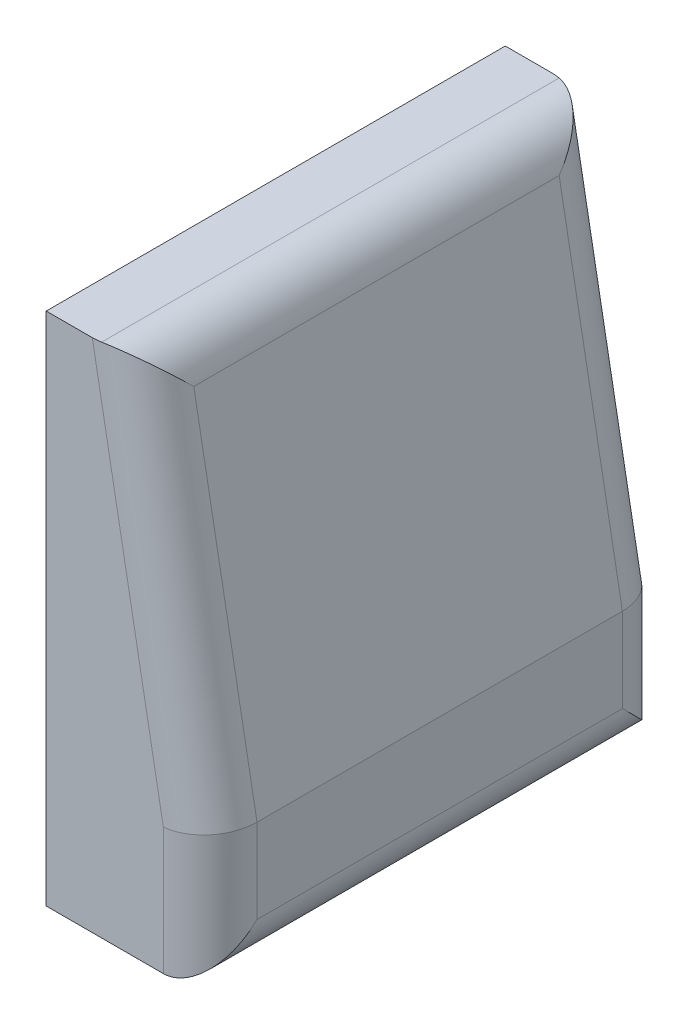
ISO-10303-21;
HEADER;
FILE_DESCRIPTION(('STEP AP214'),'2;1');
FILE_NAME('part.step','',(''),(''),'','','');
FILE_SCHEMA(('AUTOMOTIVE_DESIGN { 1 0 10303 214 1 1 1 1 }'));
ENDSEC;
DATA;
#1=APPLICATION_CONTEXT('core data for automotive mechanical design processes');
#2=APPLICATION_PROTOCOL_DEFINITION('international standard','automotive_design',2000,#1);
#3=PRODUCT_CONTEXT('',#1,'mechanical');
#4=PRODUCT('Part','Part','',(#3));
#5=PRODUCT_RELATED_PRODUCT_CATEGORY('part','',(#4));
#6=PRODUCT_DEFINITION_FORMATION('','',#4);
#7=PRODUCT_DEFINITION_CONTEXT('part definition',#1,'design');
#8=PRODUCT_DEFINITION('design','',#6,#7);
#9=PRODUCT_DEFINITION_SHAPE('','',#8);
#10=(LENGTH_UNIT() NAMED_UNIT(*) SI_UNIT(.MILLI.,.METRE.));
#11=(NAMED_UNIT(*) PLANE_ANGLE_UNIT() SI_UNIT($,.RADIAN.));
#12=(NAMED_UNIT(*) SI_UNIT($,.STERADIAN.) SOLID_ANGLE_UNIT());
#13=UNCERTAINTY_MEASURE_WITH_UNIT(LENGTH_MEASURE(1.E-05),#10,'distance_accuracy_value','');
#14=(GEOMETRIC_REPRESENTATION_CONTEXT(3) GLOBAL_UNCERTAINTY_ASSIGNED_CONTEXT((#13)) GLOBAL_UNIT_ASSIGNED_CONTEXT((#10,
#11,#12)) REPRESENTATION_CONTEXT('',''));
#15=CARTESIAN_POINT('',(0.,0.,0.));
#16=DIRECTION('',(0.,0.,1.));
#17=DIRECTION('',(1.,0.,0.));
#18=AXIS2_PLACEMENT_3D('',#15,#16,#17);
#19=CARTESIAN_POINT('',(200.,664.4,490.));
#20=DIRECTION('',(0.,-1.,0.));
#21=DIRECTION('',(0.,0.,-1.));
#22=AXIS2_PLACEMENT_3D('',#19,#20,#21);
#23=PLANE('',#22);
#24=DIRECTION('',(0.,0.,-1.));
#25=VECTOR('',#24,1.);
#26=CARTESIAN_POINT('',(116.633338798208,664.4,490.));
#27=LINE('',#26,#25);
#28=CARTESIAN_POINT('',(116.633338798208,664.4,488.367740670723));
#29=VERTEX_POINT('',#28);
#30=CARTESIAN_POINT('',(116.633338798208,664.4,-488.367740670723));
#31=VERTEX_POINT('',#30);
#32=EDGE_CURVE('E53',#29,#31,#27,.T.);
#33=ORIENTED_EDGE('',*,*,#32,.T.);
#34=CARTESIAN_POINT('',(98.3406558713784,664.4,-390.));
#35=DIRECTION('',(0.,-1.,0.));
#36=DIRECTION('',(-1.,0.,0.));
#37=AXIS2_PLACEMENT_3D('',#34,#35,#36);
#38=ELLIPSE('',#37,101.659344128622,100.);
#39=CARTESIAN_POINT('',(98.3406558713785,664.4,-490.));
#40=VERTEX_POINT('',#39);
#41=EDGE_CURVE('E11',#31,#40,#38,.F.);
#42=ORIENTED_EDGE('',*,*,#41,.T.);
#43=DIRECTION('',(-1.,0.,0.));
#44=VECTOR('',#43,1.);
#45=CARTESIAN_POINT('',(200.,664.4,-490.));
#46=LINE('',#45,#44);
#47=CARTESIAN_POINT('',(0.,664.4,-490.));
#48=VERTEX_POINT('',#47);
#49=EDGE_CURVE('E135',#40,#48,#46,.T.);
#50=ORIENTED_EDGE('',*,*,#49,.T.);
#51=DIRECTION('',(0.,0.,-1.));
#52=VECTOR('',#51,1.);
#53=CARTESIAN_POINT('',(0.,664.4,490.));
#54=LINE('',#53,#52);
#55=CARTESIAN_POINT('',(0.,664.4,490.));
#56=VERTEX_POINT('',#55);
#57=EDGE_CURVE('E127',#56,#48,#54,.T.);
#58=ORIENTED_EDGE('',*,*,#57,.F.);
#59=DIRECTION('',(-1.,0.,0.));
#60=VECTOR('',#59,1.);
#61=CARTESIAN_POINT('',(200.,664.4,490.));
#62=LINE('',#61,#60);
#63=CARTESIAN_POINT('',(98.3406558713785,664.4,490.));
#64=VERTEX_POINT('',#63);
#65=EDGE_CURVE('E112',#64,#56,#62,.T.);
#66=ORIENTED_EDGE('',*,*,#65,.F.);
#67=CARTESIAN_POINT('',(98.3406558713785,664.4,390.));
#68=DIRECTION('',(0.,-1.,0.));
#69=DIRECTION('',(1.,0.,0.));
#70=AXIS2_PLACEMENT_3D('',#67,#68,#69);
#71=ELLIPSE('',#70,101.659344128622,100.);
#72=EDGE_CURVE('E64',#64,#29,#71,.F.);
#73=ORIENTED_EDGE('',*,*,#72,.T.);
#74=EDGE_LOOP('',(#33,#42,#50,#58,#66,#73));
#75=FACE_BOUND('',#74,.T.);
#76=ADVANCED_FACE('F43',(#75),#23,.F.);
#77=CARTESIAN_POINT('',(0.,664.4,490.));
#78=DIRECTION('',(1.,0.,0.));
#79=DIRECTION('',(0.,0.,-1.));
#80=AXIS2_PLACEMENT_3D('',#77,#78,#79);
#81=PLANE('',#80);
#82=DIRECTION('',(0.,-1.,0.));
#83=VECTOR('',#82,1.);
#84=CARTESIAN_POINT('',(0.,664.4,-490.));
#85=LINE('',#84,#83);
#86=CARTESIAN_POINT('',(0.,-435.6,-490.));
#87=VERTEX_POINT('',#86);
#88=EDGE_CURVE('E207',#48,#87,#85,.T.);
#89=ORIENTED_EDGE('',*,*,#88,.T.);
#90=DIRECTION('',(0.,0.,-1.));
#91=VECTOR('',#90,1.);
#92=CARTESIAN_POINT('',(0.,-435.6,490.));
#93=LINE('',#92,#91);
#94=CARTESIAN_POINT('',(0.,-435.6,490.));
#95=VERTEX_POINT('',#94);
#96=EDGE_CURVE('E129',#95,#87,#93,.T.);
#97=ORIENTED_EDGE('',*,*,#96,.F.);
#98=DIRECTION('',(0.,-1.,0.));
#99=VECTOR('',#98,1.);
#100=CARTESIAN_POINT('',(0.,664.4,490.));
#101=LINE('',#100,#99);
#102=EDGE_CURVE('E116',#56,#95,#101,.T.);
#103=ORIENTED_EDGE('',*,*,#102,.F.);
#104=ORIENTED_EDGE('',*,*,#57,.T.);
#105=EDGE_LOOP('',(#89,#97,#103,#104));
#106=FACE_BOUND('',#105,.T.);
#107=ADVANCED_FACE('F126',(#106),#81,.F.);
#108=CARTESIAN_POINT('',(0.,-435.6,490.));
#109=DIRECTION('',(0.,1.,0.));
#110=DIRECTION('',(-1.,0.,0.));
#111=AXIS2_PLACEMENT_3D('',#108,#109,#110);
#112=PLANE('',#111);
#113=DIRECTION('',(1.,0.,0.));
#114=VECTOR('',#113,1.);
#115=CARTESIAN_POINT('',(0.,-435.6,-490.));
#116=LINE('',#115,#114);
#117=CARTESIAN_POINT('',(250.,-435.6,-490.));
#118=VERTEX_POINT('',#117);
#119=EDGE_CURVE('E122',#87,#118,#116,.T.);
#120=ORIENTED_EDGE('',*,*,#119,.T.);
#121=DIRECTION('',(0.,0.,-1.));
#122=VECTOR('',#121,1.);
#123=CARTESIAN_POINT('',(250.,-435.6,490.));
#124=LINE('',#123,#122);
#125=CARTESIAN_POINT('',(250.,-435.6,490.));
#126=VERTEX_POINT('',#125);
#127=EDGE_CURVE('E154',#118,#126,#124,.F.);
#128=ORIENTED_EDGE('',*,*,#127,.T.);
#129=DIRECTION('',(1.,0.,0.));
#130=VECTOR('',#129,1.);
#131=CARTESIAN_POINT('',(0.,-435.6,490.));
#132=LINE('',#131,#130);
#133=EDGE_CURVE('E132',#95,#126,#132,.T.);
#134=ORIENTED_EDGE('',*,*,#133,.F.);
#135=ORIENTED_EDGE('',*,*,#96,.T.);
#136=EDGE_LOOP('',(#120,#128,#134,#135));
#137=FACE_BOUND('',#136,.T.);
#138=ADVANCED_FACE('F222',(#137),#112,.F.);
#139=CARTESIAN_POINT('',(350.,-435.6,490.));
#140=DIRECTION('',(-1.,0.,0.));
#141=DIRECTION('',(0.,0.,1.));
#142=AXIS2_PLACEMENT_3D('',#139,#140,#141);
#143=PLANE('',#142);
#144=DIRECTION('',(0.,0.,-1.));
#145=VECTOR('',#144,1.);
#146=CARTESIAN_POINT('',(350.,-155.6,490.));
#147=LINE('',#146,#145);
#148=CARTESIAN_POINT('',(350.,-155.6,390.));
#149=VERTEX_POINT('',#148);
#150=CARTESIAN_POINT('',(350.,-155.6,-390.));
#151=VERTEX_POINT('',#150);
#152=EDGE_CURVE('E144',#149,#151,#147,.T.);
#153=ORIENTED_EDGE('',*,*,#152,.F.);
#154=DIRECTION('',(0.,1.,0.));
#155=VECTOR('',#154,1.);
#156=CARTESIAN_POINT('',(350.,-435.6,390.));
#157=LINE('',#156,#155);
#158=CARTESIAN_POINT('',(350.,-335.6,390.));
#159=VERTEX_POINT('',#158);
#160=EDGE_CURVE('E151',#149,#159,#157,.F.);
#161=ORIENTED_EDGE('',*,*,#160,.T.);
#162=DIRECTION('',(0.,0.,-1.));
#163=VECTOR('',#162,1.);
#164=CARTESIAN_POINT('',(350.,-335.6,490.));
#165=LINE('',#164,#163);
#166=CARTESIAN_POINT('',(350.,-335.6,-390.));
#167=VERTEX_POINT('',#166);
#168=EDGE_CURVE('E142',#159,#167,#165,.T.);
#169=ORIENTED_EDGE('',*,*,#168,.T.);
#170=DIRECTION('',(0.,1.,0.));
#171=VECTOR('',#170,1.);
#172=CARTESIAN_POINT('',(350.,-435.6,-390.));
#173=LINE('',#172,#171);
#174=EDGE_CURVE('E138',#167,#151,#173,.T.);
#175=ORIENTED_EDGE('',*,*,#174,.T.);
#176=EDGE_LOOP('',(#153,#161,#169,#175));
#177=FACE_BOUND('',#176,.T.);
#178=ADVANCED_FACE('F236',(#177),#143,.F.);
#179=CARTESIAN_POINT('',(350.,-155.6,490.));
#180=DIRECTION('',(-0.983677406707226,-0.17994098903181,0.));
#181=DIRECTION('',(0.17994098903181,-0.983677406707226,0.));
#182=AXIS2_PLACEMENT_3D('',#179,#180,#181);
#183=PLANE('',#182);
#184=ORIENTED_EDGE('',*,*,#152,.T.);
#185=DIRECTION('',(-0.17994098903181,0.983677406707226,0.));
#186=VECTOR('',#185,1.);
#187=CARTESIAN_POINT('',(350.,-155.6,-390.));
#188=LINE('',#187,#186);
#189=CARTESIAN_POINT('',(215.00107946893,582.394098903181,-390.));
#190=VERTEX_POINT('',#189);
#191=EDGE_CURVE('E175',#151,#190,#188,.T.);
#192=ORIENTED_EDGE('',*,*,#191,.T.);
#193=DIRECTION('',(0.,0.,-1.));
#194=VECTOR('',#193,1.);
#195=CARTESIAN_POINT('',(215.00107946893,582.394098903181,490.));
#196=LINE('',#195,#194);
#197=CARTESIAN_POINT('',(215.00107946893,582.394098903181,390.));
#198=VERTEX_POINT('',#197);
#199=EDGE_CURVE('E172',#190,#198,#196,.F.);
#200=ORIENTED_EDGE('',*,*,#199,.T.);
#201=DIRECTION('',(-0.17994098903181,0.983677406707226,0.));
#202=VECTOR('',#201,1.);
#203=CARTESIAN_POINT('',(350.,-155.6,390.));
#204=LINE('',#203,#202);
#205=EDGE_CURVE('E169',#198,#149,#204,.F.);
#206=ORIENTED_EDGE('',*,*,#205,.T.);
#207=EDGE_LOOP('',(#184,#192,#200,#206));
#208=FACE_BOUND('',#207,.T.);
#209=ADVANCED_FACE('F242',(#208),#183,.F.);
#210=CARTESIAN_POINT('',(0.,0.,490.));
#211=DIRECTION('',(0.,0.,1.));
#212=DIRECTION('',(1.,0.,0.));
#213=AXIS2_PLACEMENT_3D('',#210,#211,#212);
#214=PLANE('',#213);
#215=ORIENTED_EDGE('',*,*,#133,.T.);
#216=DIRECTION('',(0.,1.,0.));
#217=VECTOR('',#216,1.);
#218=CARTESIAN_POINT('',(250.,-155.6,490.));
#219=LINE('',#218,#217);
#220=CARTESIAN_POINT('',(250.,-164.671081236464,490.));
#221=VERTEX_POINT('',#220);
#222=EDGE_CURVE('E160',#126,#221,#219,.T.);
#223=ORIENTED_EDGE('',*,*,#222,.T.);
#224=DIRECTION('',(-0.17994098903181,0.983677406707226,0.));
#225=VECTOR('',#224,1.);
#226=CARTESIAN_POINT('',(101.632259329277,646.405901096819,490.));
#227=LINE('',#226,#225);
#228=EDGE_CURVE('E119',#221,#64,#227,.T.);
#229=ORIENTED_EDGE('',*,*,#228,.T.);
#230=ORIENTED_EDGE('',*,*,#65,.T.);
#231=ORIENTED_EDGE('',*,*,#102,.T.);
#232=EDGE_LOOP('',(#215,#223,#229,#230,#231));
#233=FACE_BOUND('',#232,.T.);
#234=ADVANCED_FACE('F115',(#233),#214,.T.);
#235=CARTESIAN_POINT('',(0.,0.,-490.));
#236=DIRECTION('',(0.,0.,1.));
#237=DIRECTION('',(1.,0.,0.));
#238=AXIS2_PLACEMENT_3D('',#235,#236,#237);
#239=PLANE('',#238);
#240=DIRECTION('',(-0.17994098903181,0.983677406707226,0.));
#241=VECTOR('',#240,1.);
#242=CARTESIAN_POINT('',(212.757888916268,38.9191260212686,-490.));
#243=LINE('',#242,#241);
#244=CARTESIAN_POINT('',(250.,-164.671081236465,-490.));
#245=VERTEX_POINT('',#244);
#246=EDGE_CURVE('E163',#40,#245,#243,.F.);
#247=ORIENTED_EDGE('',*,*,#246,.T.);
#248=DIRECTION('',(0.,1.,0.));
#249=VECTOR('',#248,1.);
#250=CARTESIAN_POINT('',(250.,0.,-490.));
#251=LINE('',#250,#249);
#252=EDGE_CURVE('E166',#245,#118,#251,.F.);
#253=ORIENTED_EDGE('',*,*,#252,.T.);
#254=ORIENTED_EDGE('',*,*,#119,.F.);
#255=ORIENTED_EDGE('',*,*,#88,.F.);
#256=ORIENTED_EDGE('',*,*,#49,.F.);
#257=EDGE_LOOP('',(#247,#253,#254,#255,#256));
#258=FACE_BOUND('',#257,.T.);
#259=ADVANCED_FACE('F248',(#258),#239,.F.);
#260=CARTESIAN_POINT('',(116.633338798208,564.4,490.));
#261=DIRECTION('',(0.,0.,-1.));
#262=DIRECTION('',(-1.,0.,0.));
#263=AXIS2_PLACEMENT_3D('',#260,#261,#262);
#264=CYLINDRICAL_SURFACE('',#263,100.);
#265=CARTESIAN_POINT('',(116.633338798208,564.4,-390.));
#266=DIRECTION('',(0.127237493557807,-0.695564964782677,-0.707106781186547));
#267=DIRECTION('',(-0.127237493557807,0.695564964782677,-0.707106781186547));
#268=AXIS2_PLACEMENT_3D('',#265,#266,#267);
#269=ELLIPSE('',#268,141.42135623731,100.);
#270=EDGE_CURVE('E195',#31,#190,#269,.T.);
#271=ORIENTED_EDGE('',*,*,#270,.F.);
#272=ORIENTED_EDGE('',*,*,#32,.F.);
#273=CARTESIAN_POINT('',(116.633338798208,564.4,390.));
#274=DIRECTION('',(0.127237493557807,-0.695564964782677,0.707106781186547));
#275=DIRECTION('',(0.127237493557807,-0.695564964782677,-0.707106781186547));
#276=AXIS2_PLACEMENT_3D('',#273,#274,#275);
#277=ELLIPSE('',#276,141.42135623731,100.);
#278=EDGE_CURVE('E47',#198,#29,#277,.T.);
#279=ORIENTED_EDGE('',*,*,#278,.F.);
#280=ORIENTED_EDGE('',*,*,#199,.F.);
#281=EDGE_LOOP('',(#271,#272,#279,#280));
#282=FACE_BOUND('',#281,.T.);
#283=ADVANCED_FACE('F45',(#282),#264,.T.);
#284=CARTESIAN_POINT('',(212.757888916268,38.9191260212686,390.));
#285=DIRECTION('',(0.17994098903181,-0.983677406707226,0.));
#286=DIRECTION('',(0.983677406707226,0.17994098903181,0.));
#287=AXIS2_PLACEMENT_3D('',#284,#285,#286);
#288=CYLINDRICAL_SURFACE('',#287,100.);
#289=ORIENTED_EDGE('',*,*,#72,.F.);
#290=ORIENTED_EDGE('',*,*,#228,.F.);
#291=CARTESIAN_POINT('',(250.,-164.671081236464,390.));
#292=DIRECTION('',(0.0903398950983828,-0.995910991682296,0.));
#293=DIRECTION('',(0.995910991682295,0.0903398950983823,0.));
#294=AXIS2_PLACEMENT_3D('',#291,#292,#293);
#295=ELLIPSE('',#294,100.410579695561,100.);
#296=EDGE_CURVE('E192',#149,#221,#295,.T.);
#297=ORIENTED_EDGE('',*,*,#296,.F.);
#298=ORIENTED_EDGE('',*,*,#205,.F.);
#299=ORIENTED_EDGE('',*,*,#278,.T.);
#300=EDGE_LOOP('',(#289,#290,#297,#298,#299));
#301=FACE_BOUND('',#300,.T.);
#302=ADVANCED_FACE('F241',(#301),#288,.T.);
#303=CARTESIAN_POINT('',(251.632259329277,-173.594098903181,-390.));
#304=DIRECTION('',(-0.17994098903181,0.983677406707226,0.));
#305=DIRECTION('',(-0.983677406707226,-0.17994098903181,0.));
#306=AXIS2_PLACEMENT_3D('',#303,#304,#305);
#307=CYLINDRICAL_SURFACE('',#306,100.);
#308=ORIENTED_EDGE('',*,*,#270,.T.);
#309=ORIENTED_EDGE('',*,*,#191,.F.);
#310=CARTESIAN_POINT('',(250.,-164.671081236464,-390.));
#311=DIRECTION('',(-0.0903398950983828,0.995910991682296,0.));
#312=DIRECTION('',(-0.995910991682295,-0.0903398950983823,0.));
#313=AXIS2_PLACEMENT_3D('',#310,#311,#312);
#314=ELLIPSE('',#313,100.410579695561,100.);
#315=EDGE_CURVE('E188',#245,#151,#314,.F.);
#316=ORIENTED_EDGE('',*,*,#315,.F.);
#317=ORIENTED_EDGE('',*,*,#246,.F.);
#318=ORIENTED_EDGE('',*,*,#41,.F.);
#319=EDGE_LOOP('',(#308,#309,#316,#317,#318));
#320=FACE_BOUND('',#319,.T.);
#321=ADVANCED_FACE('F246',(#320),#307,.T.);
#322=CARTESIAN_POINT('',(250.,0.,390.));
#323=DIRECTION('',(0.,-1.,0.));
#324=DIRECTION('',(0.,0.,-1.));
#325=AXIS2_PLACEMENT_3D('',#322,#323,#324);
#326=CYLINDRICAL_SURFACE('',#325,100.);
#327=ORIENTED_EDGE('',*,*,#296,.T.);
#328=ORIENTED_EDGE('',*,*,#222,.F.);
#329=CARTESIAN_POINT('',(250.,-335.6,390.));
#330=DIRECTION('',(0.,-0.707106781186547,-0.707106781186547));
#331=DIRECTION('',(0.,-0.707106781186547,0.707106781186547));
#332=AXIS2_PLACEMENT_3D('',#329,#330,#331);
#333=ELLIPSE('',#332,141.42135623731,100.);
#334=EDGE_CURVE('E185',#159,#126,#333,.T.);
#335=ORIENTED_EDGE('',*,*,#334,.F.);
#336=ORIENTED_EDGE('',*,*,#160,.F.);
#337=EDGE_LOOP('',(#327,#328,#335,#336));
#338=FACE_BOUND('',#337,.T.);
#339=ADVANCED_FACE('F240',(#338),#326,.T.);
#340=CARTESIAN_POINT('',(250.,-435.6,-390.));
#341=DIRECTION('',(0.,1.,0.));
#342=DIRECTION('',(0.,0.,1.));
#343=AXIS2_PLACEMENT_3D('',#340,#341,#342);
#344=CYLINDRICAL_SURFACE('',#343,100.);
#345=ORIENTED_EDGE('',*,*,#315,.T.);
#346=ORIENTED_EDGE('',*,*,#174,.F.);
#347=CARTESIAN_POINT('',(250.,-335.6,-390.));
#348=DIRECTION('',(0.,0.707106781186547,-0.707106781186547));
#349=DIRECTION('',(0.,0.707106781186547,0.707106781186547));
#350=AXIS2_PLACEMENT_3D('',#347,#348,#349);
#351=ELLIPSE('',#350,141.42135623731,100.);
#352=EDGE_CURVE('E182',#118,#167,#351,.F.);
#353=ORIENTED_EDGE('',*,*,#352,.F.);
#354=ORIENTED_EDGE('',*,*,#252,.F.);
#355=EDGE_LOOP('',(#345,#346,#353,#354));
#356=FACE_BOUND('',#355,.T.);
#357=ADVANCED_FACE('F233',(#356),#344,.T.);
#358=CARTESIAN_POINT('',(250.,-335.6,490.));
#359=DIRECTION('',(0.,0.,-1.));
#360=DIRECTION('',(-1.,0.,0.));
#361=AXIS2_PLACEMENT_3D('',#358,#359,#360);
#362=CYLINDRICAL_SURFACE('',#361,100.);
#363=ORIENTED_EDGE('',*,*,#334,.T.);
#364=ORIENTED_EDGE('',*,*,#127,.F.);
#365=ORIENTED_EDGE('',*,*,#352,.T.);
#366=ORIENTED_EDGE('',*,*,#168,.F.);
#367=EDGE_LOOP('',(#363,#364,#365,#366));
#368=FACE_BOUND('',#367,.T.);
#369=ADVANCED_FACE('F227',(#368),#362,.T.);
#370=CLOSED_SHELL('',(#76,#107,#138,#178,#209,#234,#259,#283,#302,#321,#339,#357,#369));
#371=MANIFOLD_SOLID_BREP('B2',#370);
#372=ADVANCED_BREP_SHAPE_REPRESENTATION('',(#18,#371),#14);
#373=SHAPE_DEFINITION_REPRESENTATION(#9,#372);
ENDSEC;
END-ISO-10303-21;
